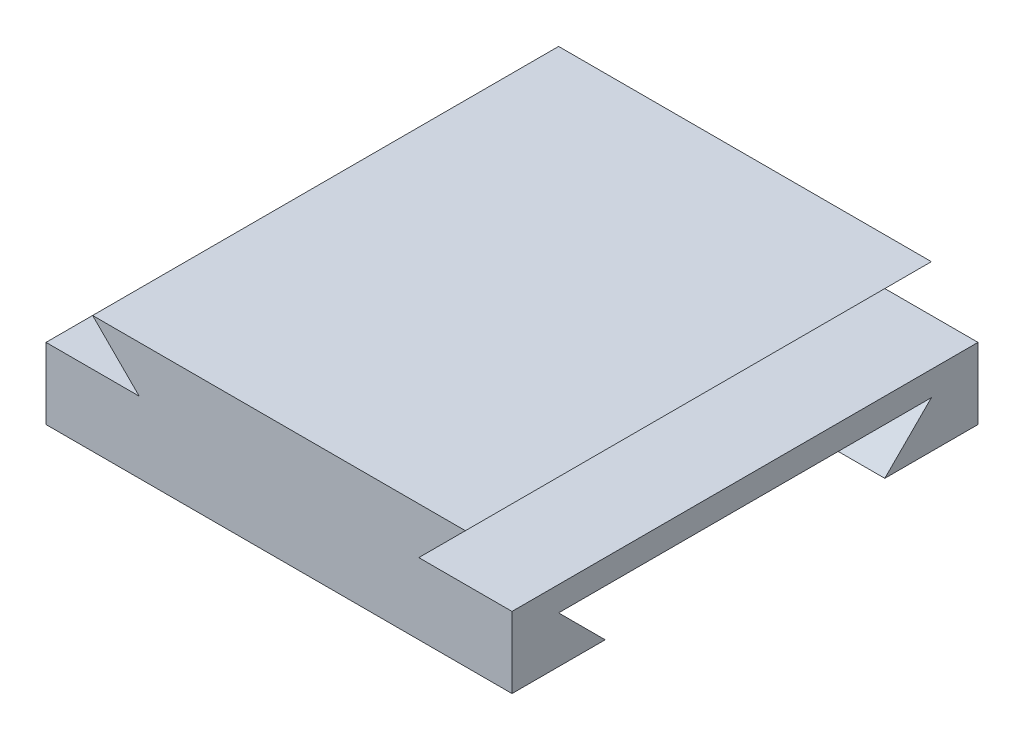
ISO-10303-21;
HEADER;
FILE_DESCRIPTION(('STEP AP214'),'2;1');
FILE_NAME('part.step','',(''),(''),'','','');
FILE_SCHEMA(('AUTOMOTIVE_DESIGN { 1 0 10303 214 1 1 1 1 }'));
ENDSEC;
DATA;
#1=APPLICATION_CONTEXT('core data for automotive mechanical design processes');
#2=APPLICATION_PROTOCOL_DEFINITION('international standard','automotive_design',2000,#1);
#3=PRODUCT_CONTEXT('',#1,'mechanical');
#4=PRODUCT('Part','Part','',(#3));
#5=PRODUCT_RELATED_PRODUCT_CATEGORY('part','',(#4));
#6=PRODUCT_DEFINITION_FORMATION('','',#4);
#7=PRODUCT_DEFINITION_CONTEXT('part definition',#1,'design');
#8=PRODUCT_DEFINITION('design','',#6,#7);
#9=PRODUCT_DEFINITION_SHAPE('','',#8);
#10=(LENGTH_UNIT() NAMED_UNIT(*) SI_UNIT(.MILLI.,.METRE.));
#11=(NAMED_UNIT(*) PLANE_ANGLE_UNIT() SI_UNIT($,.RADIAN.));
#12=(NAMED_UNIT(*) SI_UNIT($,.STERADIAN.) SOLID_ANGLE_UNIT());
#13=UNCERTAINTY_MEASURE_WITH_UNIT(LENGTH_MEASURE(1.E-05),#10,'distance_accuracy_value','');
#14=(GEOMETRIC_REPRESENTATION_CONTEXT(3) GLOBAL_UNCERTAINTY_ASSIGNED_CONTEXT((#13)) GLOBAL_UNIT_ASSIGNED_CONTEXT((#10,
#11,#12)) REPRESENTATION_CONTEXT('',''));
#15=CARTESIAN_POINT('',(0.,0.,0.));
#16=DIRECTION('',(0.,0.,1.));
#17=DIRECTION('',(1.,0.,0.));
#18=AXIS2_PLACEMENT_3D('',#15,#16,#17);
#19=CARTESIAN_POINT('',(100.,18.7709451023038,50.));
#20=DIRECTION('',(0.,-1.,0.));
#21=DIRECTION('',(0.,0.,-1.));
#22=AXIS2_PLACEMENT_3D('',#19,#20,#21);
#23=PLANE('',#22);
#24=DIRECTION('',(0.,0.,-1.));
#25=VECTOR('',#24,1.);
#26=CARTESIAN_POINT('',(80.,18.7709451023038,50.));
#27=LINE('',#26,#25);
#28=CARTESIAN_POINT('',(80.,18.7709451023038,50.));
#29=VERTEX_POINT('',#28);
#30=CARTESIAN_POINT('',(80.,18.7709451023038,-50.));
#31=VERTEX_POINT('',#30);
#32=EDGE_CURVE('E148',#29,#31,#27,.T.);
#33=ORIENTED_EDGE('',*,*,#32,.F.);
#34=DIRECTION('',(-1.,0.,0.));
#35=VECTOR('',#34,1.);
#36=CARTESIAN_POINT('',(100.,18.7709451023038,50.));
#37=LINE('',#36,#35);
#38=CARTESIAN_POINT('',(100.,18.7709451023038,50.));
#39=VERTEX_POINT('',#38);
#40=EDGE_CURVE('E162',#39,#29,#37,.T.);
#41=ORIENTED_EDGE('',*,*,#40,.F.);
#42=DIRECTION('',(0.,0.,1.));
#43=VECTOR('',#42,1.);
#44=CARTESIAN_POINT('',(100.,18.7709451023038,50.));
#45=LINE('',#44,#43);
#46=CARTESIAN_POINT('',(100.,18.7709451023038,-50.));
#47=VERTEX_POINT('',#46);
#48=EDGE_CURVE('E57',#47,#39,#45,.T.);
#49=ORIENTED_EDGE('',*,*,#48,.F.);
#50=DIRECTION('',(-1.,0.,0.));
#51=VECTOR('',#50,1.);
#52=CARTESIAN_POINT('',(100.,18.7709451023038,-50.));
#53=LINE('',#52,#51);
#54=EDGE_CURVE('E136',#47,#31,#53,.T.);
#55=ORIENTED_EDGE('',*,*,#54,.T.);
#56=EDGE_LOOP('',(#33,#41,#49,#55));
#57=FACE_BOUND('',#56,.T.);
#58=ADVANCED_FACE('F33',(#57),#23,.F.);
#59=CARTESIAN_POINT('',(100.,3.49999999999999,50.));
#60=DIRECTION('',(0.,0.,-1.));
#61=DIRECTION('',(-1.,0.,0.));
#62=AXIS2_PLACEMENT_3D('',#59,#60,#61);
#63=PLANE('',#62);
#64=DIRECTION('',(0.,-1.,0.));
#65=VECTOR('',#64,1.);
#66=CARTESIAN_POINT('',(0.,3.49999999999999,50.));
#67=LINE('',#66,#65);
#68=CARTESIAN_POINT('',(0.,18.7709451023038,50.));
#69=VERTEX_POINT('',#68);
#70=CARTESIAN_POINT('',(0.,3.49999999999999,50.));
#71=VERTEX_POINT('',#70);
#72=EDGE_CURVE('E145',#69,#71,#67,.T.);
#73=ORIENTED_EDGE('',*,*,#72,.T.);
#74=DIRECTION('',(-1.,0.,0.));
#75=VECTOR('',#74,1.);
#76=CARTESIAN_POINT('',(100.,3.49999999999999,50.));
#77=LINE('',#76,#75);
#78=CARTESIAN_POINT('',(100.,3.49999999999999,50.));
#79=VERTEX_POINT('',#78);
#80=EDGE_CURVE('E11',#79,#71,#77,.T.);
#81=ORIENTED_EDGE('',*,*,#80,.F.);
#82=DIRECTION('',(0.,-1.,0.));
#83=VECTOR('',#82,1.);
#84=CARTESIAN_POINT('',(100.,3.49999999999999,50.));
#85=LINE('',#84,#83);
#86=EDGE_CURVE('E161',#39,#79,#85,.T.);
#87=ORIENTED_EDGE('',*,*,#86,.F.);
#88=ORIENTED_EDGE('',*,*,#40,.T.);
#89=DIRECTION('',(-0.707106781186548,-0.707106781186547,0.));
#90=VECTOR('',#89,1.);
#91=CARTESIAN_POINT('',(80.,18.7709451023038,50.));
#92=LINE('',#91,#90);
#93=CARTESIAN_POINT('',(90.,28.7709451023038,50.));
#94=VERTEX_POINT('',#93);
#95=EDGE_CURVE('E200',#94,#29,#92,.T.);
#96=ORIENTED_EDGE('',*,*,#95,.F.);
#97=DIRECTION('',(1.,0.,0.));
#98=VECTOR('',#97,1.);
#99=CARTESIAN_POINT('',(90.,28.7709451023038,50.));
#100=LINE('',#99,#98);
#101=CARTESIAN_POINT('',(10.,28.7709451023038,50.));
#102=VERTEX_POINT('',#101);
#103=EDGE_CURVE('E216',#102,#94,#100,.T.);
#104=ORIENTED_EDGE('',*,*,#103,.F.);
#105=DIRECTION('',(-0.707106781186547,0.707106781186548,0.));
#106=VECTOR('',#105,1.);
#107=CARTESIAN_POINT('',(10.,28.7709451023038,50.));
#108=LINE('',#107,#106);
#109=CARTESIAN_POINT('',(20.,18.7709451023038,50.));
#110=VERTEX_POINT('',#109);
#111=EDGE_CURVE('E209',#110,#102,#108,.T.);
#112=ORIENTED_EDGE('',*,*,#111,.F.);
#113=EDGE_CURVE('E91',#110,#69,#37,.T.);
#114=ORIENTED_EDGE('',*,*,#113,.T.);
#115=EDGE_LOOP('',(#73,#81,#87,#88,#96,#104,#112,#114));
#116=FACE_BOUND('',#115,.T.);
#117=ADVANCED_FACE('F35',(#116),#63,.F.);
#118=CARTESIAN_POINT('',(100.,3.5,30.));
#119=DIRECTION('',(0.,1.,0.));
#120=DIRECTION('',(0.,0.,1.));
#121=AXIS2_PLACEMENT_3D('',#118,#119,#120);
#122=PLANE('',#121);
#123=DIRECTION('',(0.,0.,-1.));
#124=VECTOR('',#123,1.);
#125=CARTESIAN_POINT('',(0.,3.5,30.));
#126=LINE('',#125,#124);
#127=CARTESIAN_POINT('',(0.,3.5,30.));
#128=VERTEX_POINT('',#127);
#129=EDGE_CURVE('E147',#71,#128,#126,.T.);
#130=ORIENTED_EDGE('',*,*,#129,.T.);
#131=DIRECTION('',(-1.,0.,0.));
#132=VECTOR('',#131,1.);
#133=CARTESIAN_POINT('',(100.,3.5,30.));
#134=LINE('',#133,#132);
#135=CARTESIAN_POINT('',(100.,3.5,30.));
#136=VERTEX_POINT('',#135);
#137=EDGE_CURVE('E41',#136,#128,#134,.T.);
#138=ORIENTED_EDGE('',*,*,#137,.F.);
#139=DIRECTION('',(0.,0.,-1.));
#140=VECTOR('',#139,1.);
#141=CARTESIAN_POINT('',(100.,3.5,30.));
#142=LINE('',#141,#140);
#143=EDGE_CURVE('E99',#79,#136,#142,.T.);
#144=ORIENTED_EDGE('',*,*,#143,.F.);
#145=ORIENTED_EDGE('',*,*,#80,.T.);
#146=EDGE_LOOP('',(#130,#138,#144,#145));
#147=FACE_BOUND('',#146,.T.);
#148=ADVANCED_FACE('F237',(#147),#122,.F.);
#149=CARTESIAN_POINT('',(100.,3.5,30.));
#150=DIRECTION('',(0.,-0.707106781186552,0.707106781186544));
#151=DIRECTION('',(0.,-0.707106781186544,-0.707106781186551));
#152=AXIS2_PLACEMENT_3D('',#149,#150,#151);
#153=PLANE('',#152);
#154=DIRECTION('',(0.,0.707106781186544,0.707106781186551));
#155=VECTOR('',#154,1.);
#156=CARTESIAN_POINT('',(0.,3.5,30.));
#157=LINE('',#156,#155);
#158=CARTESIAN_POINT('',(0.,13.5,40.0000000000001));
#159=VERTEX_POINT('',#158);
#160=EDGE_CURVE('E150',#128,#159,#157,.T.);
#161=ORIENTED_EDGE('',*,*,#160,.T.);
#162=DIRECTION('',(-1.,0.,0.));
#163=VECTOR('',#162,1.);
#164=CARTESIAN_POINT('',(100.,13.5,40.0000000000001));
#165=LINE('',#164,#163);
#166=CARTESIAN_POINT('',(100.,13.5,40.0000000000001));
#167=VERTEX_POINT('',#166);
#168=EDGE_CURVE('E171',#167,#159,#165,.T.);
#169=ORIENTED_EDGE('',*,*,#168,.F.);
#170=DIRECTION('',(0.,0.707106781186544,0.707106781186551));
#171=VECTOR('',#170,1.);
#172=CARTESIAN_POINT('',(100.,3.5,30.));
#173=LINE('',#172,#171);
#174=EDGE_CURVE('E179',#136,#167,#173,.T.);
#175=ORIENTED_EDGE('',*,*,#174,.F.);
#176=ORIENTED_EDGE('',*,*,#137,.T.);
#177=EDGE_LOOP('',(#161,#169,#175,#176));
#178=FACE_BOUND('',#177,.T.);
#179=ADVANCED_FACE('F177',(#178),#153,.F.);
#180=CARTESIAN_POINT('',(100.,13.5,40.0000000000001));
#181=DIRECTION('',(0.,1.,0.));
#182=DIRECTION('',(0.,0.,1.));
#183=AXIS2_PLACEMENT_3D('',#180,#181,#182);
#184=PLANE('',#183);
#185=DIRECTION('',(0.,0.,-1.));
#186=VECTOR('',#185,1.);
#187=CARTESIAN_POINT('',(0.,13.5,40.0000000000001));
#188=LINE('',#187,#186);
#189=CARTESIAN_POINT('',(0.,13.5,-39.9999999999999));
#190=VERTEX_POINT('',#189);
#191=EDGE_CURVE('E152',#159,#190,#188,.T.);
#192=ORIENTED_EDGE('',*,*,#191,.T.);
#193=DIRECTION('',(-1.,0.,0.));
#194=VECTOR('',#193,1.);
#195=CARTESIAN_POINT('',(100.,13.5,-39.9999999999999));
#196=LINE('',#195,#194);
#197=CARTESIAN_POINT('',(100.,13.5,-39.9999999999999));
#198=VERTEX_POINT('',#197);
#199=EDGE_CURVE('E168',#198,#190,#196,.T.);
#200=ORIENTED_EDGE('',*,*,#199,.F.);
#201=DIRECTION('',(0.,0.,-1.));
#202=VECTOR('',#201,1.);
#203=CARTESIAN_POINT('',(100.,13.5,40.0000000000001));
#204=LINE('',#203,#202);
#205=EDGE_CURVE('E191',#167,#198,#204,.T.);
#206=ORIENTED_EDGE('',*,*,#205,.F.);
#207=ORIENTED_EDGE('',*,*,#168,.T.);
#208=EDGE_LOOP('',(#192,#200,#206,#207));
#209=FACE_BOUND('',#208,.T.);
#210=ADVANCED_FACE('F187',(#209),#184,.F.);
#211=CARTESIAN_POINT('',(100.,13.5,-39.9999999999999));
#212=DIRECTION('',(0.,-0.707106781186543,-0.707106781186552));
#213=DIRECTION('',(0.,0.707106781186552,-0.707106781186543));
#214=AXIS2_PLACEMENT_3D('',#211,#212,#213);
#215=PLANE('',#214);
#216=DIRECTION('',(0.,-0.707106781186552,0.707106781186543));
#217=VECTOR('',#216,1.);
#218=CARTESIAN_POINT('',(0.,13.5,-39.9999999999999));
#219=LINE('',#218,#217);
#220=CARTESIAN_POINT('',(0.,3.5,-30.));
#221=VERTEX_POINT('',#220);
#222=EDGE_CURVE('E154',#190,#221,#219,.T.);
#223=ORIENTED_EDGE('',*,*,#222,.T.);
#224=DIRECTION('',(-1.,0.,0.));
#225=VECTOR('',#224,1.);
#226=CARTESIAN_POINT('',(100.,3.5,-30.));
#227=LINE('',#226,#225);
#228=CARTESIAN_POINT('',(100.,3.5,-30.));
#229=VERTEX_POINT('',#228);
#230=EDGE_CURVE('E135',#229,#221,#227,.T.);
#231=ORIENTED_EDGE('',*,*,#230,.F.);
#232=DIRECTION('',(0.,-0.707106781186552,0.707106781186543));
#233=VECTOR('',#232,1.);
#234=CARTESIAN_POINT('',(100.,13.5,-39.9999999999999));
#235=LINE('',#234,#233);
#236=EDGE_CURVE('E122',#198,#229,#235,.T.);
#237=ORIENTED_EDGE('',*,*,#236,.F.);
#238=ORIENTED_EDGE('',*,*,#199,.T.);
#239=EDGE_LOOP('',(#223,#231,#237,#238));
#240=FACE_BOUND('',#239,.T.);
#241=ADVANCED_FACE('F190',(#240),#215,.F.);
#242=CARTESIAN_POINT('',(100.,3.50000000000001,-50.));
#243=DIRECTION('',(0.,1.,0.));
#244=DIRECTION('',(0.,0.,1.));
#245=AXIS2_PLACEMENT_3D('',#242,#243,#244);
#246=PLANE('',#245);
#247=DIRECTION('',(0.,0.,-1.));
#248=VECTOR('',#247,1.);
#249=CARTESIAN_POINT('',(0.,3.50000000000001,-50.));
#250=LINE('',#249,#248);
#251=CARTESIAN_POINT('',(0.,3.50000000000001,-50.));
#252=VERTEX_POINT('',#251);
#253=EDGE_CURVE('E131',#221,#252,#250,.T.);
#254=ORIENTED_EDGE('',*,*,#253,.T.);
#255=DIRECTION('',(-1.,0.,0.));
#256=VECTOR('',#255,1.);
#257=CARTESIAN_POINT('',(100.,3.50000000000001,-50.));
#258=LINE('',#257,#256);
#259=CARTESIAN_POINT('',(100.,3.50000000000001,-50.));
#260=VERTEX_POINT('',#259);
#261=EDGE_CURVE('E128',#260,#252,#258,.T.);
#262=ORIENTED_EDGE('',*,*,#261,.F.);
#263=DIRECTION('',(0.,0.,-1.));
#264=VECTOR('',#263,1.);
#265=CARTESIAN_POINT('',(100.,3.50000000000001,-50.));
#266=LINE('',#265,#264);
#267=EDGE_CURVE('E115',#229,#260,#266,.T.);
#268=ORIENTED_EDGE('',*,*,#267,.F.);
#269=ORIENTED_EDGE('',*,*,#230,.T.);
#270=EDGE_LOOP('',(#254,#262,#268,#269));
#271=FACE_BOUND('',#270,.T.);
#272=ADVANCED_FACE('F129',(#271),#246,.F.);
#273=CARTESIAN_POINT('',(100.,18.7709451023038,-50.));
#274=DIRECTION('',(0.,0.,1.));
#275=DIRECTION('',(1.,0.,0.));
#276=AXIS2_PLACEMENT_3D('',#273,#274,#275);
#277=PLANE('',#276);
#278=DIRECTION('',(0.,1.,0.));
#279=VECTOR('',#278,1.);
#280=CARTESIAN_POINT('',(0.,18.7709451023038,-50.));
#281=LINE('',#280,#279);
#282=CARTESIAN_POINT('',(0.,18.7709451023038,-50.));
#283=VERTEX_POINT('',#282);
#284=EDGE_CURVE('E157',#252,#283,#281,.T.);
#285=ORIENTED_EDGE('',*,*,#284,.T.);
#286=CARTESIAN_POINT('',(20.,18.7709451023038,-50.));
#287=VERTEX_POINT('',#286);
#288=EDGE_CURVE('E165',#287,#283,#53,.T.);
#289=ORIENTED_EDGE('',*,*,#288,.F.);
#290=DIRECTION('',(-0.707106781186547,0.707106781186548,0.));
#291=VECTOR('',#290,1.);
#292=CARTESIAN_POINT('',(10.,28.7709451023038,-50.));
#293=LINE('',#292,#291);
#294=CARTESIAN_POINT('',(10.,28.7709451023038,-50.));
#295=VERTEX_POINT('',#294);
#296=EDGE_CURVE('E48',#287,#295,#293,.T.);
#297=ORIENTED_EDGE('',*,*,#296,.T.);
#298=DIRECTION('',(1.,0.,0.));
#299=VECTOR('',#298,1.);
#300=CARTESIAN_POINT('',(90.,28.7709451023038,-50.));
#301=LINE('',#300,#299);
#302=CARTESIAN_POINT('',(90.,28.7709451023038,-50.));
#303=VERTEX_POINT('',#302);
#304=EDGE_CURVE('E210',#295,#303,#301,.T.);
#305=ORIENTED_EDGE('',*,*,#304,.T.);
#306=DIRECTION('',(-0.707106781186548,-0.707106781186547,0.));
#307=VECTOR('',#306,1.);
#308=CARTESIAN_POINT('',(80.,18.7709451023038,-50.));
#309=LINE('',#308,#307);
#310=EDGE_CURVE('E207',#303,#31,#309,.T.);
#311=ORIENTED_EDGE('',*,*,#310,.T.);
#312=ORIENTED_EDGE('',*,*,#54,.F.);
#313=DIRECTION('',(0.,1.,0.));
#314=VECTOR('',#313,1.);
#315=CARTESIAN_POINT('',(100.,18.7709451023038,-50.));
#316=LINE('',#315,#314);
#317=EDGE_CURVE('E119',#260,#47,#316,.T.);
#318=ORIENTED_EDGE('',*,*,#317,.F.);
#319=ORIENTED_EDGE('',*,*,#261,.T.);
#320=EDGE_LOOP('',(#285,#289,#297,#305,#311,#312,#318,#319));
#321=FACE_BOUND('',#320,.T.);
#322=ADVANCED_FACE('F138',(#321),#277,.F.);
#323=ORIENTED_EDGE('',*,*,#113,.F.);
#324=DIRECTION('',(0.,0.,-1.));
#325=VECTOR('',#324,1.);
#326=CARTESIAN_POINT('',(20.,18.7709451023038,50.));
#327=LINE('',#326,#325);
#328=EDGE_CURVE('E197',#110,#287,#327,.T.);
#329=ORIENTED_EDGE('',*,*,#328,.T.);
#330=ORIENTED_EDGE('',*,*,#288,.T.);
#331=DIRECTION('',(0.,0.,1.));
#332=VECTOR('',#331,1.);
#333=CARTESIAN_POINT('',(0.,18.7709451023038,50.));
#334=LINE('',#333,#332);
#335=EDGE_CURVE('E159',#283,#69,#334,.T.);
#336=ORIENTED_EDGE('',*,*,#335,.T.);
#337=EDGE_LOOP('',(#323,#329,#330,#336));
#338=FACE_BOUND('',#337,.T.);
#339=ADVANCED_FACE('F232',(#338),#23,.F.);
#340=CARTESIAN_POINT('',(100.,0.,0.));
#341=DIRECTION('',(-1.,0.,0.));
#342=DIRECTION('',(0.,0.,1.));
#343=AXIS2_PLACEMENT_3D('',#340,#341,#342);
#344=PLANE('',#343);
#345=ORIENTED_EDGE('',*,*,#86,.T.);
#346=ORIENTED_EDGE('',*,*,#143,.T.);
#347=ORIENTED_EDGE('',*,*,#174,.T.);
#348=ORIENTED_EDGE('',*,*,#205,.T.);
#349=ORIENTED_EDGE('',*,*,#236,.T.);
#350=ORIENTED_EDGE('',*,*,#267,.T.);
#351=ORIENTED_EDGE('',*,*,#317,.T.);
#352=ORIENTED_EDGE('',*,*,#48,.T.);
#353=EDGE_LOOP('',(#345,#346,#347,#348,#349,#350,#351,#352));
#354=FACE_BOUND('',#353,.T.);
#355=ADVANCED_FACE('F117',(#354),#344,.F.);
#356=CARTESIAN_POINT('',(0.,0.,0.));
#357=DIRECTION('',(-1.,0.,0.));
#358=DIRECTION('',(0.,0.,1.));
#359=AXIS2_PLACEMENT_3D('',#356,#357,#358);
#360=PLANE('',#359);
#361=ORIENTED_EDGE('',*,*,#72,.F.);
#362=ORIENTED_EDGE('',*,*,#335,.F.);
#363=ORIENTED_EDGE('',*,*,#284,.F.);
#364=ORIENTED_EDGE('',*,*,#253,.F.);
#365=ORIENTED_EDGE('',*,*,#222,.F.);
#366=ORIENTED_EDGE('',*,*,#191,.F.);
#367=ORIENTED_EDGE('',*,*,#160,.F.);
#368=ORIENTED_EDGE('',*,*,#129,.F.);
#369=EDGE_LOOP('',(#361,#362,#363,#364,#365,#366,#367,#368));
#370=FACE_BOUND('',#369,.T.);
#371=ADVANCED_FACE('F183',(#370),#360,.T.);
#372=CARTESIAN_POINT('',(80.,18.7709451023038,50.));
#373=DIRECTION('',(0.707106781186547,-0.707106781186548,0.));
#374=DIRECTION('',(0.707106781186548,0.707106781186547,0.));
#375=AXIS2_PLACEMENT_3D('',#372,#373,#374);
#376=PLANE('',#375);
#377=ORIENTED_EDGE('',*,*,#310,.F.);
#378=DIRECTION('',(0.,0.,-1.));
#379=VECTOR('',#378,1.);
#380=CARTESIAN_POINT('',(90.,28.7709451023038,50.));
#381=LINE('',#380,#379);
#382=EDGE_CURVE('E202',#94,#303,#381,.T.);
#383=ORIENTED_EDGE('',*,*,#382,.F.);
#384=ORIENTED_EDGE('',*,*,#95,.T.);
#385=ORIENTED_EDGE('',*,*,#32,.T.);
#386=EDGE_LOOP('',(#377,#383,#384,#385));
#387=FACE_BOUND('',#386,.T.);
#388=ADVANCED_FACE('F294',(#387),#376,.T.);
#389=CARTESIAN_POINT('',(90.,28.7709451023038,50.));
#390=DIRECTION('',(0.,1.,0.));
#391=DIRECTION('',(0.,0.,1.));
#392=AXIS2_PLACEMENT_3D('',#389,#390,#391);
#393=PLANE('',#392);
#394=ORIENTED_EDGE('',*,*,#304,.F.);
#395=DIRECTION('',(0.,0.,-1.));
#396=VECTOR('',#395,1.);
#397=CARTESIAN_POINT('',(10.,28.7709451023038,50.));
#398=LINE('',#397,#396);
#399=EDGE_CURVE('E199',#102,#295,#398,.T.);
#400=ORIENTED_EDGE('',*,*,#399,.F.);
#401=ORIENTED_EDGE('',*,*,#103,.T.);
#402=ORIENTED_EDGE('',*,*,#382,.T.);
#403=EDGE_LOOP('',(#394,#400,#401,#402));
#404=FACE_BOUND('',#403,.T.);
#405=ADVANCED_FACE('F321',(#404),#393,.T.);
#406=CARTESIAN_POINT('',(10.,28.7709451023038,50.));
#407=DIRECTION('',(-0.707106781186548,-0.707106781186547,0.));
#408=DIRECTION('',(0.707106781186547,-0.707106781186548,0.));
#409=AXIS2_PLACEMENT_3D('',#406,#407,#408);
#410=PLANE('',#409);
#411=ORIENTED_EDGE('',*,*,#296,.F.);
#412=ORIENTED_EDGE('',*,*,#328,.F.);
#413=ORIENTED_EDGE('',*,*,#111,.T.);
#414=ORIENTED_EDGE('',*,*,#399,.T.);
#415=EDGE_LOOP('',(#411,#412,#413,#414));
#416=FACE_BOUND('',#415,.T.);
#417=ADVANCED_FACE('F221',(#416),#410,.T.);
#418=CLOSED_SHELL('',(#58,#117,#148,#179,#210,#241,#272,#322,#339,#355,#371,#388,#405,#417));
#419=MANIFOLD_SOLID_BREP('B2',#418);
#420=ADVANCED_BREP_SHAPE_REPRESENTATION('',(#18,#419),#14);
#421=SHAPE_DEFINITION_REPRESENTATION(#9,#420);
ENDSEC;
END-ISO-10303-21;
